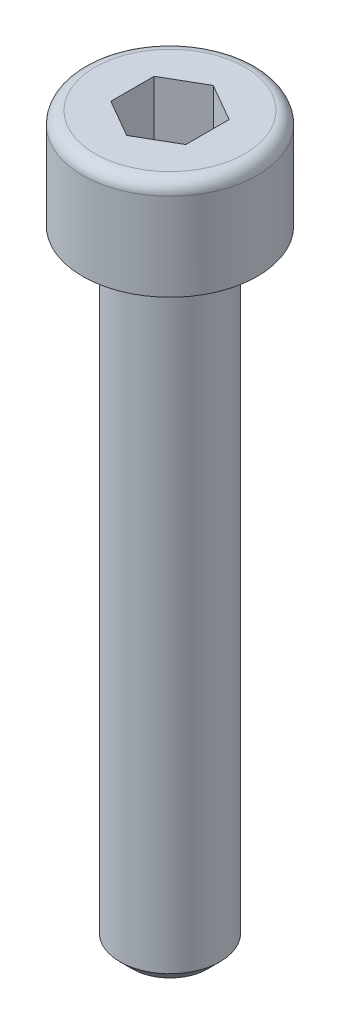
ISO-10303-21;
HEADER;
FILE_DESCRIPTION(('STEP AP214'),'2;1');
FILE_NAME('part.step','',(''),(''),'','','');
FILE_SCHEMA(('AUTOMOTIVE_DESIGN { 1 0 10303 214 1 1 1 1 }'));
ENDSEC;
DATA;
#1=APPLICATION_CONTEXT('core data for automotive mechanical design processes');
#2=APPLICATION_PROTOCOL_DEFINITION('international standard','automotive_design',2000,#1);
#3=PRODUCT_CONTEXT('',#1,'mechanical');
#4=PRODUCT('Part','Part','',(#3));
#5=PRODUCT_RELATED_PRODUCT_CATEGORY('part','',(#4));
#6=PRODUCT_DEFINITION_FORMATION('','',#4);
#7=PRODUCT_DEFINITION_CONTEXT('part definition',#1,'design');
#8=PRODUCT_DEFINITION('design','',#6,#7);
#9=PRODUCT_DEFINITION_SHAPE('','',#8);
#10=(LENGTH_UNIT() NAMED_UNIT(*) SI_UNIT(.MILLI.,.METRE.));
#11=(NAMED_UNIT(*) PLANE_ANGLE_UNIT() SI_UNIT($,.RADIAN.));
#12=(NAMED_UNIT(*) SI_UNIT($,.STERADIAN.) SOLID_ANGLE_UNIT());
#13=UNCERTAINTY_MEASURE_WITH_UNIT(LENGTH_MEASURE(1.E-05),#10,'distance_accuracy_value','');
#14=(GEOMETRIC_REPRESENTATION_CONTEXT(3) GLOBAL_UNCERTAINTY_ASSIGNED_CONTEXT((#13)) GLOBAL_UNIT_ASSIGNED_CONTEXT((#10,
#11,#12)) REPRESENTATION_CONTEXT('',''));
#15=CARTESIAN_POINT('',(0.,0.,0.));
#16=DIRECTION('',(0.,0.,1.));
#17=DIRECTION('',(1.,0.,0.));
#18=AXIS2_PLACEMENT_3D('',#15,#16,#17);
#19=CARTESIAN_POINT('',(0.,0.,0.));
#20=DIRECTION('',(0.,-1.,0.));
#21=DIRECTION('',(0.,0.,-1.));
#22=AXIS2_PLACEMENT_3D('',#19,#20,#21);
#23=PLANE('',#22);
#24=CARTESIAN_POINT('',(0.,0.,0.));
#25=DIRECTION('',(0.,-1.,0.));
#26=DIRECTION('',(0.,0.,-1.));
#27=AXIS2_PLACEMENT_3D('',#24,#25,#26);
#28=CIRCLE('',#27,3.);
#29=CARTESIAN_POINT('',(0.,0.,-3.));
#30=VERTEX_POINT('',#29);
#31=EDGE_CURVE('E42',#30,#30,#28,.F.);
#32=ORIENTED_EDGE('',*,*,#31,.T.);
#33=EDGE_LOOP('',(#32));
#34=FACE_BOUND('',#33,.T.);
#35=DIRECTION('',(-0.866025403784439,0.,-0.5));
#36=VECTOR('',#35,1.);
#37=CARTESIAN_POINT('',(1.5,0.,-0.866025403784438));
#38=LINE('',#37,#36);
#39=CARTESIAN_POINT('',(1.5,0.,-0.866025403784438));
#40=VERTEX_POINT('',#39);
#41=CARTESIAN_POINT('',(0.,0.,-1.73205080756888));
#42=VERTEX_POINT('',#41);
#43=EDGE_CURVE('E123',#40,#42,#38,.T.);
#44=ORIENTED_EDGE('',*,*,#43,.F.);
#45=DIRECTION('',(0.,0.,-1.));
#46=VECTOR('',#45,1.);
#47=CARTESIAN_POINT('',(1.5,0.,0.866025403784439));
#48=LINE('',#47,#46);
#49=CARTESIAN_POINT('',(1.5,0.,0.866025403784439));
#50=VERTEX_POINT('',#49);
#51=EDGE_CURVE('E49',#50,#40,#48,.T.);
#52=ORIENTED_EDGE('',*,*,#51,.F.);
#53=DIRECTION('',(0.866025403784439,0.,-0.5));
#54=VECTOR('',#53,1.);
#55=CARTESIAN_POINT('',(0.,0.,1.73205080756888));
#56=LINE('',#55,#54);
#57=CARTESIAN_POINT('',(0.,0.,1.73205080756888));
#58=VERTEX_POINT('',#57);
#59=EDGE_CURVE('E132',#58,#50,#56,.T.);
#60=ORIENTED_EDGE('',*,*,#59,.F.);
#61=DIRECTION('',(0.866025403784439,0.,0.5));
#62=VECTOR('',#61,1.);
#63=CARTESIAN_POINT('',(-1.5,0.,0.866025403784438));
#64=LINE('',#63,#62);
#65=CARTESIAN_POINT('',(-1.5,0.,0.866025403784438));
#66=VERTEX_POINT('',#65);
#67=EDGE_CURVE('E130',#66,#58,#64,.T.);
#68=ORIENTED_EDGE('',*,*,#67,.F.);
#69=DIRECTION('',(0.,0.,1.));
#70=VECTOR('',#69,1.);
#71=CARTESIAN_POINT('',(-1.5,0.,-0.866025403784439));
#72=LINE('',#71,#70);
#73=CARTESIAN_POINT('',(-1.5,0.,-0.866025403784439));
#74=VERTEX_POINT('',#73);
#75=EDGE_CURVE('E97',#74,#66,#72,.T.);
#76=ORIENTED_EDGE('',*,*,#75,.F.);
#77=DIRECTION('',(-0.866025403784439,0.,0.5));
#78=VECTOR('',#77,1.);
#79=CARTESIAN_POINT('',(0.,0.,-1.73205080756888));
#80=LINE('',#79,#78);
#81=EDGE_CURVE('E126',#42,#74,#80,.T.);
#82=ORIENTED_EDGE('',*,*,#81,.F.);
#83=EDGE_LOOP('',(#44,#52,#60,#68,#76,#82));
#84=FACE_BOUND('',#83,.T.);
#85=ADVANCED_FACE('F34',(#34,#84),#23,.F.);
#86=CARTESIAN_POINT('',(0.,0.,0.));
#87=DIRECTION('',(0.,1.,0.));
#88=DIRECTION('',(0.,0.,1.));
#89=AXIS2_PLACEMENT_3D('',#86,#87,#88);
#90=CYLINDRICAL_SURFACE('',#89,3.5);
#91=CARTESIAN_POINT('',(0.,-0.5,0.));
#92=DIRECTION('',(0.,-1.,0.));
#93=DIRECTION('',(0.,0.,-1.));
#94=AXIS2_PLACEMENT_3D('',#91,#92,#93);
#95=CIRCLE('',#94,3.5);
#96=CARTESIAN_POINT('',(0.,-0.5,-3.5));
#97=VERTEX_POINT('',#96);
#98=EDGE_CURVE('E11',#97,#97,#95,.T.);
#99=ORIENTED_EDGE('',*,*,#98,.T.);
#100=EDGE_LOOP('',(#99));
#101=FACE_BOUND('',#100,.T.);
#102=CARTESIAN_POINT('',(0.,-4.,0.));
#103=DIRECTION('',(0.,1.,0.));
#104=DIRECTION('',(0.,0.,1.));
#105=AXIS2_PLACEMENT_3D('',#102,#103,#104);
#106=CIRCLE('',#105,3.5);
#107=CARTESIAN_POINT('',(0.,-4.,3.5));
#108=VERTEX_POINT('',#107);
#109=EDGE_CURVE('E144',#108,#108,#106,.T.);
#110=ORIENTED_EDGE('',*,*,#109,.T.);
#111=EDGE_LOOP('',(#110));
#112=FACE_BOUND('',#111,.T.);
#113=ADVANCED_FACE('F166',(#101,#112),#90,.T.);
#114=CARTESIAN_POINT('',(3.5,-4.,0.));
#115=DIRECTION('',(0.,1.,0.));
#116=DIRECTION('',(0.,0.,1.));
#117=AXIS2_PLACEMENT_3D('',#114,#115,#116);
#118=PLANE('',#117);
#119=ORIENTED_EDGE('',*,*,#109,.F.);
#120=EDGE_LOOP('',(#119));
#121=FACE_BOUND('',#120,.T.);
#122=CARTESIAN_POINT('',(0.,-4.,0.));
#123=DIRECTION('',(0.,1.,0.));
#124=DIRECTION('',(0.,0.,1.));
#125=AXIS2_PLACEMENT_3D('',#122,#123,#124);
#126=CIRCLE('',#125,2.);
#127=CARTESIAN_POINT('',(0.,-4.,2.));
#128=VERTEX_POINT('',#127);
#129=EDGE_CURVE('E136',#128,#128,#126,.T.);
#130=ORIENTED_EDGE('',*,*,#129,.T.);
#131=EDGE_LOOP('',(#130));
#132=FACE_BOUND('',#131,.T.);
#133=ADVANCED_FACE('F171',(#121,#132),#118,.F.);
#134=CARTESIAN_POINT('',(0.,0.,0.));
#135=DIRECTION('',(0.,1.,0.));
#136=DIRECTION('',(0.,0.,1.));
#137=AXIS2_PLACEMENT_3D('',#134,#135,#136);
#138=CYLINDRICAL_SURFACE('',#137,2.);
#139=CARTESIAN_POINT('',(0.,-28.5,0.));
#140=DIRECTION('',(0.,1.,0.));
#141=DIRECTION('',(0.,0.,1.));
#142=AXIS2_PLACEMENT_3D('',#139,#140,#141);
#143=CIRCLE('',#142,2.);
#144=CARTESIAN_POINT('',(0.,-28.5,2.));
#145=VERTEX_POINT('',#144);
#146=EDGE_CURVE('E147',#145,#145,#143,.T.);
#147=ORIENTED_EDGE('',*,*,#146,.T.);
#148=EDGE_LOOP('',(#147));
#149=FACE_BOUND('',#148,.T.);
#150=ORIENTED_EDGE('',*,*,#129,.F.);
#151=EDGE_LOOP('',(#150));
#152=FACE_BOUND('',#151,.T.);
#153=ADVANCED_FACE('F177',(#149,#152),#138,.T.);
#154=CARTESIAN_POINT('',(2.,-29.,0.));
#155=DIRECTION('',(0.,1.,0.));
#156=DIRECTION('',(0.,0.,1.));
#157=AXIS2_PLACEMENT_3D('',#154,#155,#156);
#158=PLANE('',#157);
#159=CARTESIAN_POINT('',(0.,-29.,0.));
#160=DIRECTION('',(0.,1.,0.));
#161=DIRECTION('',(0.,0.,1.));
#162=AXIS2_PLACEMENT_3D('',#159,#160,#161);
#163=CIRCLE('',#162,1.5);
#164=CARTESIAN_POINT('',(0.,-29.,1.5));
#165=VERTEX_POINT('',#164);
#166=EDGE_CURVE('E150',#165,#165,#163,.F.);
#167=ORIENTED_EDGE('',*,*,#166,.T.);
#168=EDGE_LOOP('',(#167));
#169=FACE_BOUND('',#168,.T.);
#170=ADVANCED_FACE('F181',(#169),#158,.F.);
#171=CARTESIAN_POINT('',(1.5,-3.,0.866025403784439));
#172=DIRECTION('',(1.,0.,0.));
#173=DIRECTION('',(0.,0.,-1.));
#174=AXIS2_PLACEMENT_3D('',#171,#172,#173);
#175=PLANE('',#174);
#176=ORIENTED_EDGE('',*,*,#51,.T.);
#177=DIRECTION('',(0.,1.,0.));
#178=VECTOR('',#177,1.);
#179=CARTESIAN_POINT('',(1.5,-3.,-0.866025403784438));
#180=LINE('',#179,#178);
#181=CARTESIAN_POINT('',(1.5,-3.,-0.866025403784438));
#182=VERTEX_POINT('',#181);
#183=EDGE_CURVE('E79',#182,#40,#180,.T.);
#184=ORIENTED_EDGE('',*,*,#183,.F.);
#185=DIRECTION('',(0.,0.,-1.));
#186=VECTOR('',#185,1.);
#187=CARTESIAN_POINT('',(1.5,-3.,0.866025403784439));
#188=LINE('',#187,#186);
#189=CARTESIAN_POINT('',(1.5,-3.,0.866025403784439));
#190=VERTEX_POINT('',#189);
#191=EDGE_CURVE('E134',#190,#182,#188,.T.);
#192=ORIENTED_EDGE('',*,*,#191,.F.);
#193=DIRECTION('',(0.,1.,0.));
#194=VECTOR('',#193,1.);
#195=CARTESIAN_POINT('',(1.5,-3.,0.866025403784439));
#196=LINE('',#195,#194);
#197=EDGE_CURVE('E57',#190,#50,#196,.T.);
#198=ORIENTED_EDGE('',*,*,#197,.T.);
#199=EDGE_LOOP('',(#176,#184,#192,#198));
#200=FACE_BOUND('',#199,.T.);
#201=ADVANCED_FACE('F185',(#200),#175,.F.);
#202=CARTESIAN_POINT('',(0.,-3.,1.73205080756888));
#203=DIRECTION('',(0.5,0.,0.866025403784439));
#204=DIRECTION('',(0.866025403784439,0.,-0.5));
#205=AXIS2_PLACEMENT_3D('',#202,#203,#204);
#206=PLANE('',#205);
#207=ORIENTED_EDGE('',*,*,#59,.T.);
#208=ORIENTED_EDGE('',*,*,#197,.F.);
#209=DIRECTION('',(0.866025403784439,0.,-0.5));
#210=VECTOR('',#209,1.);
#211=CARTESIAN_POINT('',(0.,-3.,1.73205080756888));
#212=LINE('',#211,#210);
#213=CARTESIAN_POINT('',(0.,-3.,1.73205080756888));
#214=VERTEX_POINT('',#213);
#215=EDGE_CURVE('E109',#214,#190,#212,.T.);
#216=ORIENTED_EDGE('',*,*,#215,.F.);
#217=DIRECTION('',(0.,1.,0.));
#218=VECTOR('',#217,1.);
#219=CARTESIAN_POINT('',(0.,-3.,1.73205080756888));
#220=LINE('',#219,#218);
#221=EDGE_CURVE('E101',#214,#58,#220,.T.);
#222=ORIENTED_EDGE('',*,*,#221,.T.);
#223=EDGE_LOOP('',(#207,#208,#216,#222));
#224=FACE_BOUND('',#223,.T.);
#225=ADVANCED_FACE('F189',(#224),#206,.F.);
#226=CARTESIAN_POINT('',(-1.5,-3.,0.866025403784438));
#227=DIRECTION('',(-0.5,0.,0.866025403784438));
#228=DIRECTION('',(0.866025403784439,0.,0.5));
#229=AXIS2_PLACEMENT_3D('',#226,#227,#228);
#230=PLANE('',#229);
#231=ORIENTED_EDGE('',*,*,#67,.T.);
#232=ORIENTED_EDGE('',*,*,#221,.F.);
#233=DIRECTION('',(0.866025403784439,0.,0.5));
#234=VECTOR('',#233,1.);
#235=CARTESIAN_POINT('',(-1.5,-3.,0.866025403784438));
#236=LINE('',#235,#234);
#237=CARTESIAN_POINT('',(-1.5,-3.,0.866025403784438));
#238=VERTEX_POINT('',#237);
#239=EDGE_CURVE('E105',#238,#214,#236,.T.);
#240=ORIENTED_EDGE('',*,*,#239,.F.);
#241=DIRECTION('',(0.,1.,0.));
#242=VECTOR('',#241,1.);
#243=CARTESIAN_POINT('',(-1.5,-3.,0.866025403784438));
#244=LINE('',#243,#242);
#245=EDGE_CURVE('E90',#238,#66,#244,.T.);
#246=ORIENTED_EDGE('',*,*,#245,.T.);
#247=EDGE_LOOP('',(#231,#232,#240,#246));
#248=FACE_BOUND('',#247,.T.);
#249=ADVANCED_FACE('F106',(#248),#230,.F.);
#250=CARTESIAN_POINT('',(-1.5,-3.,-0.866025403784439));
#251=DIRECTION('',(-1.,0.,0.));
#252=DIRECTION('',(0.,0.,1.));
#253=AXIS2_PLACEMENT_3D('',#250,#251,#252);
#254=PLANE('',#253);
#255=ORIENTED_EDGE('',*,*,#75,.T.);
#256=ORIENTED_EDGE('',*,*,#245,.F.);
#257=DIRECTION('',(0.,0.,1.));
#258=VECTOR('',#257,1.);
#259=CARTESIAN_POINT('',(-1.5,-3.,-0.866025403784439));
#260=LINE('',#259,#258);
#261=CARTESIAN_POINT('',(-1.5,-3.,-0.866025403784439));
#262=VERTEX_POINT('',#261);
#263=EDGE_CURVE('E94',#262,#238,#260,.T.);
#264=ORIENTED_EDGE('',*,*,#263,.F.);
#265=DIRECTION('',(0.,1.,0.));
#266=VECTOR('',#265,1.);
#267=CARTESIAN_POINT('',(-1.5,-3.,-0.866025403784439));
#268=LINE('',#267,#266);
#269=EDGE_CURVE('E102',#262,#74,#268,.T.);
#270=ORIENTED_EDGE('',*,*,#269,.T.);
#271=EDGE_LOOP('',(#255,#256,#264,#270));
#272=FACE_BOUND('',#271,.T.);
#273=ADVANCED_FACE('F92',(#272),#254,.F.);
#274=CARTESIAN_POINT('',(0.,-3.,-1.73205080756888));
#275=DIRECTION('',(-0.5,0.,-0.866025403784439));
#276=DIRECTION('',(-0.866025403784439,0.,0.5));
#277=AXIS2_PLACEMENT_3D('',#274,#275,#276);
#278=PLANE('',#277);
#279=ORIENTED_EDGE('',*,*,#81,.T.);
#280=ORIENTED_EDGE('',*,*,#269,.F.);
#281=DIRECTION('',(-0.866025403784439,0.,0.5));
#282=VECTOR('',#281,1.);
#283=CARTESIAN_POINT('',(0.,-3.,-1.73205080756888));
#284=LINE('',#283,#282);
#285=CARTESIAN_POINT('',(0.,-3.,-1.73205080756888));
#286=VERTEX_POINT('',#285);
#287=EDGE_CURVE('E115',#286,#262,#284,.T.);
#288=ORIENTED_EDGE('',*,*,#287,.F.);
#289=DIRECTION('',(0.,1.,0.));
#290=VECTOR('',#289,1.);
#291=CARTESIAN_POINT('',(0.,-3.,-1.73205080756888));
#292=LINE('',#291,#290);
#293=EDGE_CURVE('E139',#286,#42,#292,.T.);
#294=ORIENTED_EDGE('',*,*,#293,.T.);
#295=EDGE_LOOP('',(#279,#280,#288,#294));
#296=FACE_BOUND('',#295,.T.);
#297=ADVANCED_FACE('F193',(#296),#278,.F.);
#298=CARTESIAN_POINT('',(1.5,-3.,-0.866025403784438));
#299=DIRECTION('',(0.5,0.,-0.866025403784439));
#300=DIRECTION('',(-0.866025403784439,0.,-0.5));
#301=AXIS2_PLACEMENT_3D('',#298,#299,#300);
#302=PLANE('',#301);
#303=ORIENTED_EDGE('',*,*,#43,.T.);
#304=ORIENTED_EDGE('',*,*,#293,.F.);
#305=DIRECTION('',(-0.866025403784439,0.,-0.5));
#306=VECTOR('',#305,1.);
#307=CARTESIAN_POINT('',(1.5,-3.,-0.866025403784438));
#308=LINE('',#307,#306);
#309=EDGE_CURVE('E117',#182,#286,#308,.T.);
#310=ORIENTED_EDGE('',*,*,#309,.F.);
#311=ORIENTED_EDGE('',*,*,#183,.T.);
#312=EDGE_LOOP('',(#303,#304,#310,#311));
#313=FACE_BOUND('',#312,.T.);
#314=ADVANCED_FACE('F190',(#313),#302,.F.);
#315=CARTESIAN_POINT('',(1.5,-3.,-0.866025403784438));
#316=DIRECTION('',(0.,1.,0.));
#317=DIRECTION('',(0.,0.,1.));
#318=AXIS2_PLACEMENT_3D('',#315,#316,#317);
#319=PLANE('',#318);
#320=ORIENTED_EDGE('',*,*,#191,.T.);
#321=ORIENTED_EDGE('',*,*,#309,.T.);
#322=ORIENTED_EDGE('',*,*,#287,.T.);
#323=ORIENTED_EDGE('',*,*,#263,.T.);
#324=ORIENTED_EDGE('',*,*,#239,.T.);
#325=ORIENTED_EDGE('',*,*,#215,.T.);
#326=EDGE_LOOP('',(#320,#321,#322,#323,#324,#325));
#327=FACE_BOUND('',#326,.T.);
#328=ADVANCED_FACE('F112',(#327),#319,.T.);
#329=CARTESIAN_POINT('',(0.,-28.5,0.));
#330=DIRECTION('',(0.,1.,0.));
#331=DIRECTION('',(0.,0.,1.));
#332=AXIS2_PLACEMENT_3D('',#329,#330,#331);
#333=CONICAL_SURFACE('',#332,2.,0.785398163397452);
#334=ORIENTED_EDGE('',*,*,#166,.F.);
#335=EDGE_LOOP('',(#334));
#336=FACE_BOUND('',#335,.T.);
#337=ORIENTED_EDGE('',*,*,#146,.F.);
#338=EDGE_LOOP('',(#337));
#339=FACE_BOUND('',#338,.T.);
#340=ADVANCED_FACE('F158',(#336,#339),#333,.T.);
#341=CARTESIAN_POINT('',(0.,-0.5,0.));
#342=DIRECTION('',(0.,-1.,0.));
#343=DIRECTION('',(0.,0.,-1.));
#344=AXIS2_PLACEMENT_3D('',#341,#342,#343);
#345=TOROIDAL_SURFACE('',#344,3.,0.5);
#346=ORIENTED_EDGE('',*,*,#98,.F.);
#347=EDGE_LOOP('',(#346));
#348=FACE_BOUND('',#347,.T.);
#349=ORIENTED_EDGE('',*,*,#31,.F.);
#350=EDGE_LOOP('',(#349));
#351=FACE_BOUND('',#350,.T.);
#352=ADVANCED_FACE('F36',(#348,#351),#345,.T.);
#353=CLOSED_SHELL('',(#85,#113,#133,#153,#170,#201,#225,#249,#273,#297,#314,#328,#340,#352));
#354=MANIFOLD_SOLID_BREP('B2',#353);
#355=ADVANCED_BREP_SHAPE_REPRESENTATION('',(#18,#354),#14);
#356=SHAPE_DEFINITION_REPRESENTATION(#9,#355);
ENDSEC;
END-ISO-10303-21;
